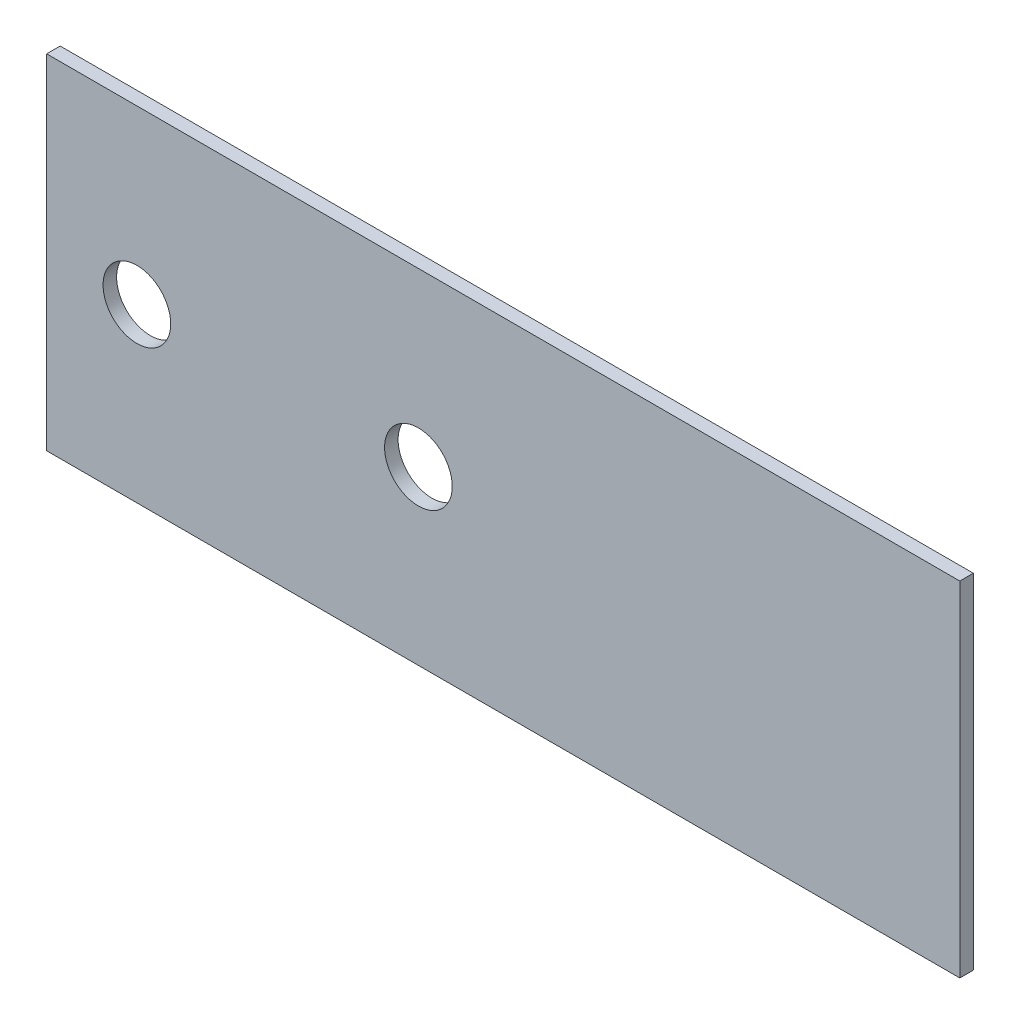
ISO-10303-21;
HEADER;
FILE_DESCRIPTION(('STEP AP214'),'2;1');
FILE_NAME('part.step','',(''),(''),'','','');
FILE_SCHEMA(('AUTOMOTIVE_DESIGN { 1 0 10303 214 1 1 1 1 }'));
ENDSEC;
DATA;
#1=APPLICATION_CONTEXT('core data for automotive mechanical design processes');
#2=APPLICATION_PROTOCOL_DEFINITION('international standard','automotive_design',2000,#1);
#3=PRODUCT_CONTEXT('',#1,'mechanical');
#4=PRODUCT('Part','Part','',(#3));
#5=PRODUCT_RELATED_PRODUCT_CATEGORY('part','',(#4));
#6=PRODUCT_DEFINITION_FORMATION('','',#4);
#7=PRODUCT_DEFINITION_CONTEXT('part definition',#1,'design');
#8=PRODUCT_DEFINITION('design','',#6,#7);
#9=PRODUCT_DEFINITION_SHAPE('','',#8);
#10=(LENGTH_UNIT() NAMED_UNIT(*) SI_UNIT(.MILLI.,.METRE.));
#11=(NAMED_UNIT(*) PLANE_ANGLE_UNIT() SI_UNIT($,.RADIAN.));
#12=(NAMED_UNIT(*) SI_UNIT($,.STERADIAN.) SOLID_ANGLE_UNIT());
#13=UNCERTAINTY_MEASURE_WITH_UNIT(LENGTH_MEASURE(1.E-05),#10,'distance_accuracy_value','');
#14=(GEOMETRIC_REPRESENTATION_CONTEXT(3) GLOBAL_UNCERTAINTY_ASSIGNED_CONTEXT((#13)) GLOBAL_UNIT_ASSIGNED_CONTEXT((#10,
#11,#12)) REPRESENTATION_CONTEXT('',''));
#15=CARTESIAN_POINT('',(0.,0.,0.));
#16=DIRECTION('',(0.,0.,1.));
#17=DIRECTION('',(1.,0.,0.));
#18=AXIS2_PLACEMENT_3D('',#15,#16,#17);
#19=CARTESIAN_POINT('',(101.2,38.1,3.));
#20=DIRECTION('',(-1.,0.,0.));
#21=DIRECTION('',(0.,-1.,0.));
#22=AXIS2_PLACEMENT_3D('',#19,#20,#21);
#23=PLANE('',#22);
#24=DIRECTION('',(0.,1.,0.));
#25=VECTOR('',#24,1.);
#26=CARTESIAN_POINT('',(101.2,38.1,0.));
#27=LINE('',#26,#25);
#28=CARTESIAN_POINT('',(101.2,-38.1,0.));
#29=VERTEX_POINT('',#28);
#30=CARTESIAN_POINT('',(101.2,38.1,0.));
#31=VERTEX_POINT('',#30);
#32=EDGE_CURVE('E107',#29,#31,#27,.T.);
#33=ORIENTED_EDGE('',*,*,#32,.T.);
#34=DIRECTION('',(0.,0.,-1.));
#35=VECTOR('',#34,1.);
#36=CARTESIAN_POINT('',(101.2,38.1,3.));
#37=LINE('',#36,#35);
#38=CARTESIAN_POINT('',(101.2,38.1,3.));
#39=VERTEX_POINT('',#38);
#40=EDGE_CURVE('E11',#39,#31,#37,.T.);
#41=ORIENTED_EDGE('',*,*,#40,.F.);
#42=DIRECTION('',(0.,1.,0.));
#43=VECTOR('',#42,1.);
#44=CARTESIAN_POINT('',(101.2,38.1,3.));
#45=LINE('',#44,#43);
#46=CARTESIAN_POINT('',(101.2,-38.1,3.));
#47=VERTEX_POINT('',#46);
#48=EDGE_CURVE('E91',#47,#39,#45,.T.);
#49=ORIENTED_EDGE('',*,*,#48,.F.);
#50=DIRECTION('',(0.,0.,-1.));
#51=VECTOR('',#50,1.);
#52=CARTESIAN_POINT('',(101.2,-38.1,3.));
#53=LINE('',#52,#51);
#54=EDGE_CURVE('E103',#47,#29,#53,.T.);
#55=ORIENTED_EDGE('',*,*,#54,.T.);
#56=EDGE_LOOP('',(#33,#41,#49,#55));
#57=FACE_BOUND('',#56,.T.);
#58=ADVANCED_FACE('F39',(#57),#23,.F.);
#59=CARTESIAN_POINT('',(-101.2,38.1,3.));
#60=DIRECTION('',(0.,-1.,0.));
#61=DIRECTION('',(0.,0.,-1.));
#62=AXIS2_PLACEMENT_3D('',#59,#60,#61);
#63=PLANE('',#62);
#64=DIRECTION('',(-1.,0.,0.));
#65=VECTOR('',#64,1.);
#66=CARTESIAN_POINT('',(-101.2,38.1,0.));
#67=LINE('',#66,#65);
#68=CARTESIAN_POINT('',(-101.2,38.1,0.));
#69=VERTEX_POINT('',#68);
#70=EDGE_CURVE('E96',#31,#69,#67,.T.);
#71=ORIENTED_EDGE('',*,*,#70,.T.);
#72=DIRECTION('',(0.,0.,-1.));
#73=VECTOR('',#72,1.);
#74=CARTESIAN_POINT('',(-101.2,38.1,3.));
#75=LINE('',#74,#73);
#76=CARTESIAN_POINT('',(-101.2,38.1,3.));
#77=VERTEX_POINT('',#76);
#78=EDGE_CURVE('E48',#77,#69,#75,.T.);
#79=ORIENTED_EDGE('',*,*,#78,.F.);
#80=DIRECTION('',(-1.,0.,0.));
#81=VECTOR('',#80,1.);
#82=CARTESIAN_POINT('',(-101.2,38.1,3.));
#83=LINE('',#82,#81);
#84=EDGE_CURVE('E86',#39,#77,#83,.T.);
#85=ORIENTED_EDGE('',*,*,#84,.F.);
#86=ORIENTED_EDGE('',*,*,#40,.T.);
#87=EDGE_LOOP('',(#71,#79,#85,#86));
#88=FACE_BOUND('',#87,.T.);
#89=ADVANCED_FACE('F95',(#88),#63,.F.);
#90=CARTESIAN_POINT('',(-101.2,38.1,3.));
#91=DIRECTION('',(1.,0.,0.));
#92=DIRECTION('',(0.,0.,-1.));
#93=AXIS2_PLACEMENT_3D('',#90,#91,#92);
#94=PLANE('',#93);
#95=DIRECTION('',(0.,-1.,0.));
#96=VECTOR('',#95,1.);
#97=CARTESIAN_POINT('',(-101.2,38.1,0.));
#98=LINE('',#97,#96);
#99=CARTESIAN_POINT('',(-101.2,-38.1,0.));
#100=VERTEX_POINT('',#99);
#101=EDGE_CURVE('E73',#69,#100,#98,.T.);
#102=ORIENTED_EDGE('',*,*,#101,.T.);
#103=DIRECTION('',(0.,0.,-1.));
#104=VECTOR('',#103,1.);
#105=CARTESIAN_POINT('',(-101.2,-38.1,3.));
#106=LINE('',#105,#104);
#107=CARTESIAN_POINT('',(-101.2,-38.1,3.));
#108=VERTEX_POINT('',#107);
#109=EDGE_CURVE('E98',#108,#100,#106,.T.);
#110=ORIENTED_EDGE('',*,*,#109,.F.);
#111=DIRECTION('',(0.,-1.,0.));
#112=VECTOR('',#111,1.);
#113=CARTESIAN_POINT('',(-101.2,38.1,3.));
#114=LINE('',#113,#112);
#115=EDGE_CURVE('E89',#77,#108,#114,.T.);
#116=ORIENTED_EDGE('',*,*,#115,.F.);
#117=ORIENTED_EDGE('',*,*,#78,.T.);
#118=EDGE_LOOP('',(#102,#110,#116,#117));
#119=FACE_BOUND('',#118,.T.);
#120=ADVANCED_FACE('F99',(#119),#94,.F.);
#121=CARTESIAN_POINT('',(-101.2,-38.1,3.));
#122=DIRECTION('',(0.,1.,0.));
#123=DIRECTION('',(0.,0.,1.));
#124=AXIS2_PLACEMENT_3D('',#121,#122,#123);
#125=PLANE('',#124);
#126=DIRECTION('',(1.,0.,0.));
#127=VECTOR('',#126,1.);
#128=CARTESIAN_POINT('',(-101.2,-38.1,0.));
#129=LINE('',#128,#127);
#130=EDGE_CURVE('E79',#100,#29,#129,.T.);
#131=ORIENTED_EDGE('',*,*,#130,.T.);
#132=ORIENTED_EDGE('',*,*,#54,.F.);
#133=DIRECTION('',(1.,0.,0.));
#134=VECTOR('',#133,1.);
#135=CARTESIAN_POINT('',(-101.2,-38.1,3.));
#136=LINE('',#135,#134);
#137=EDGE_CURVE('E56',#108,#47,#136,.T.);
#138=ORIENTED_EDGE('',*,*,#137,.F.);
#139=ORIENTED_EDGE('',*,*,#109,.T.);
#140=EDGE_LOOP('',(#131,#132,#138,#139));
#141=FACE_BOUND('',#140,.T.);
#142=ADVANCED_FACE('F121',(#141),#125,.F.);
#143=CARTESIAN_POINT('',(0.,0.,3.));
#144=DIRECTION('',(0.,0.,1.));
#145=DIRECTION('',(1.,0.,0.));
#146=AXIS2_PLACEMENT_3D('',#143,#144,#145);
#147=PLANE('',#146);
#148=CARTESIAN_POINT('',(-18.8,0.,3.));
#149=DIRECTION('',(0.,0.,1.));
#150=DIRECTION('',(1.,0.,0.));
#151=AXIS2_PLACEMENT_3D('',#148,#149,#150);
#152=CIRCLE('',#151,7.50000000000001);
#153=CARTESIAN_POINT('',(-11.3,0.,3.));
#154=VERTEX_POINT('',#153);
#155=EDGE_CURVE('E132',#154,#154,#152,.T.);
#156=ORIENTED_EDGE('',*,*,#155,.F.);
#157=EDGE_LOOP('',(#156));
#158=FACE_BOUND('',#157,.T.);
#159=CARTESIAN_POINT('',(-81.2,0.,3.));
#160=DIRECTION('',(0.,0.,1.));
#161=DIRECTION('',(1.,0.,0.));
#162=AXIS2_PLACEMENT_3D('',#159,#160,#161);
#163=CIRCLE('',#162,7.5);
#164=CARTESIAN_POINT('',(-73.7,0.,3.));
#165=VERTEX_POINT('',#164);
#166=EDGE_CURVE('E128',#165,#165,#163,.T.);
#167=ORIENTED_EDGE('',*,*,#166,.F.);
#168=EDGE_LOOP('',(#167));
#169=FACE_BOUND('',#168,.T.);
#170=ORIENTED_EDGE('',*,*,#48,.T.);
#171=ORIENTED_EDGE('',*,*,#84,.T.);
#172=ORIENTED_EDGE('',*,*,#115,.T.);
#173=ORIENTED_EDGE('',*,*,#137,.T.);
#174=EDGE_LOOP('',(#170,#171,#172,#173));
#175=FACE_BOUND('',#174,.T.);
#176=ADVANCED_FACE('F87',(#158,#169,#175),#147,.T.);
#177=CARTESIAN_POINT('',(0.,0.,0.));
#178=DIRECTION('',(0.,0.,1.));
#179=DIRECTION('',(1.,0.,0.));
#180=AXIS2_PLACEMENT_3D('',#177,#178,#179);
#181=PLANE('',#180);
#182=CARTESIAN_POINT('',(-18.8,0.,0.));
#183=DIRECTION('',(0.,0.,1.));
#184=DIRECTION('',(1.,0.,0.));
#185=AXIS2_PLACEMENT_3D('',#182,#183,#184);
#186=CIRCLE('',#185,7.50000000000001);
#187=CARTESIAN_POINT('',(-11.3,0.,0.));
#188=VERTEX_POINT('',#187);
#189=EDGE_CURVE('E139',#188,#188,#186,.T.);
#190=ORIENTED_EDGE('',*,*,#189,.T.);
#191=EDGE_LOOP('',(#190));
#192=FACE_BOUND('',#191,.T.);
#193=CARTESIAN_POINT('',(-81.2,0.,0.));
#194=DIRECTION('',(0.,0.,1.));
#195=DIRECTION('',(1.,0.,0.));
#196=AXIS2_PLACEMENT_3D('',#193,#194,#195);
#197=CIRCLE('',#196,7.5);
#198=CARTESIAN_POINT('',(-73.7,0.,0.));
#199=VERTEX_POINT('',#198);
#200=EDGE_CURVE('E111',#199,#199,#197,.T.);
#201=ORIENTED_EDGE('',*,*,#200,.T.);
#202=EDGE_LOOP('',(#201));
#203=FACE_BOUND('',#202,.T.);
#204=ORIENTED_EDGE('',*,*,#32,.F.);
#205=ORIENTED_EDGE('',*,*,#130,.F.);
#206=ORIENTED_EDGE('',*,*,#101,.F.);
#207=ORIENTED_EDGE('',*,*,#70,.F.);
#208=EDGE_LOOP('',(#204,#205,#206,#207));
#209=FACE_BOUND('',#208,.T.);
#210=ADVANCED_FACE('F124',(#192,#203,#209),#181,.F.);
#211=CARTESIAN_POINT('',(-81.2,0.,0.));
#212=DIRECTION('',(0.,0.,1.));
#213=DIRECTION('',(1.,0.,0.));
#214=AXIS2_PLACEMENT_3D('',#211,#212,#213);
#215=CYLINDRICAL_SURFACE('',#214,7.5);
#216=ORIENTED_EDGE('',*,*,#200,.F.);
#217=EDGE_LOOP('',(#216));
#218=FACE_BOUND('',#217,.T.);
#219=ORIENTED_EDGE('',*,*,#166,.T.);
#220=EDGE_LOOP('',(#219));
#221=FACE_BOUND('',#220,.T.);
#222=ADVANCED_FACE('F148',(#218,#221),#215,.F.);
#223=CARTESIAN_POINT('',(-18.8,0.,0.));
#224=DIRECTION('',(0.,0.,1.));
#225=DIRECTION('',(1.,0.,0.));
#226=AXIS2_PLACEMENT_3D('',#223,#224,#225);
#227=CYLINDRICAL_SURFACE('',#226,7.50000000000001);
#228=ORIENTED_EDGE('',*,*,#155,.T.);
#229=EDGE_LOOP('',(#228));
#230=FACE_BOUND('',#229,.T.);
#231=ORIENTED_EDGE('',*,*,#189,.F.);
#232=EDGE_LOOP('',(#231));
#233=FACE_BOUND('',#232,.T.);
#234=ADVANCED_FACE('F146',(#230,#233),#227,.F.);
#235=CLOSED_SHELL('',(#58,#89,#120,#142,#176,#210,#222,#234));
#236=MANIFOLD_SOLID_BREP('B2',#235);
#237=ADVANCED_BREP_SHAPE_REPRESENTATION('',(#18,#236),#14);
#238=SHAPE_DEFINITION_REPRESENTATION(#9,#237);
ENDSEC;
END-ISO-10303-21;
